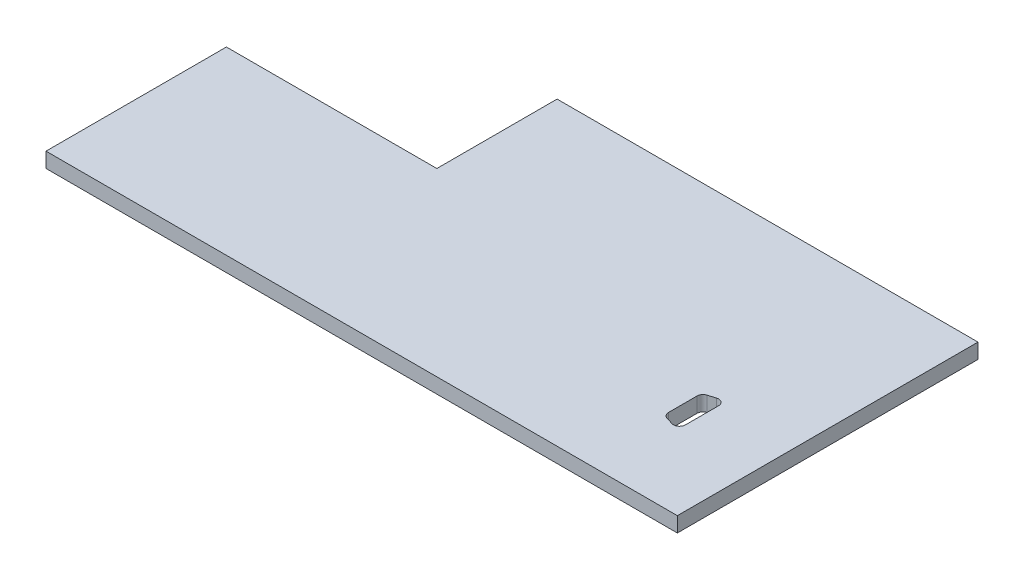
ISO-10303-21;
HEADER;
FILE_DESCRIPTION(('STEP AP214'),'2;1');
FILE_NAME('part.step','',(''),(''),'','','');
FILE_SCHEMA(('AUTOMOTIVE_DESIGN { 1 0 10303 214 1 1 1 1 }'));
ENDSEC;
DATA;
#1=APPLICATION_CONTEXT('core data for automotive mechanical design processes');
#2=APPLICATION_PROTOCOL_DEFINITION('international standard','automotive_design',2000,#1);
#3=PRODUCT_CONTEXT('',#1,'mechanical');
#4=PRODUCT('Part','Part','',(#3));
#5=PRODUCT_RELATED_PRODUCT_CATEGORY('part','',(#4));
#6=PRODUCT_DEFINITION_FORMATION('','',#4);
#7=PRODUCT_DEFINITION_CONTEXT('part definition',#1,'design');
#8=PRODUCT_DEFINITION('design','',#6,#7);
#9=PRODUCT_DEFINITION_SHAPE('','',#8);
#10=(LENGTH_UNIT() NAMED_UNIT(*) SI_UNIT(.MILLI.,.METRE.));
#11=(NAMED_UNIT(*) PLANE_ANGLE_UNIT() SI_UNIT($,.RADIAN.));
#12=(NAMED_UNIT(*) SI_UNIT($,.STERADIAN.) SOLID_ANGLE_UNIT());
#13=UNCERTAINTY_MEASURE_WITH_UNIT(LENGTH_MEASURE(1.E-05),#10,'distance_accuracy_value','');
#14=(GEOMETRIC_REPRESENTATION_CONTEXT(3) GLOBAL_UNCERTAINTY_ASSIGNED_CONTEXT((#13)) GLOBAL_UNIT_ASSIGNED_CONTEXT((#10,
#11,#12)) REPRESENTATION_CONTEXT('',''));
#15=CARTESIAN_POINT('',(0.,0.,0.));
#16=DIRECTION('',(0.,0.,1.));
#17=DIRECTION('',(1.,0.,0.));
#18=AXIS2_PLACEMENT_3D('',#15,#16,#17);
#19=CARTESIAN_POINT('',(266.7,6.35,0.));
#20=DIRECTION('',(0.,0.,-1.));
#21=DIRECTION('',(-1.,0.,0.));
#22=AXIS2_PLACEMENT_3D('',#19,#20,#21);
#23=PLANE('',#22);
#24=DIRECTION('',(1.,0.,0.));
#25=VECTOR('',#24,1.);
#26=CARTESIAN_POINT('',(266.7,0.,0.));
#27=LINE('',#26,#25);
#28=CARTESIAN_POINT('',(0.,0.,0.));
#29=VERTEX_POINT('',#28);
#30=CARTESIAN_POINT('',(266.7,0.,0.));
#31=VERTEX_POINT('',#30);
#32=EDGE_CURVE('E207',#29,#31,#27,.T.);
#33=ORIENTED_EDGE('',*,*,#32,.T.);
#34=DIRECTION('',(0.,-1.,0.));
#35=VECTOR('',#34,1.);
#36=CARTESIAN_POINT('',(266.7,6.35,0.));
#37=LINE('',#36,#35);
#38=CARTESIAN_POINT('',(266.7,6.35,0.));
#39=VERTEX_POINT('',#38);
#40=EDGE_CURVE('E255',#39,#31,#37,.T.);
#41=ORIENTED_EDGE('',*,*,#40,.F.);
#42=DIRECTION('',(1.,0.,0.));
#43=VECTOR('',#42,1.);
#44=CARTESIAN_POINT('',(266.7,6.35,0.));
#45=LINE('',#44,#43);
#46=CARTESIAN_POINT('',(0.,6.35,0.));
#47=VERTEX_POINT('',#46);
#48=EDGE_CURVE('E215',#47,#39,#45,.T.);
#49=ORIENTED_EDGE('',*,*,#48,.F.);
#50=DIRECTION('',(0.,-1.,0.));
#51=VECTOR('',#50,1.);
#52=CARTESIAN_POINT('',(0.,6.35,0.));
#53=LINE('',#52,#51);
#54=EDGE_CURVE('E229',#47,#29,#53,.T.);
#55=ORIENTED_EDGE('',*,*,#54,.T.);
#56=EDGE_LOOP('',(#33,#41,#49,#55));
#57=FACE_BOUND('',#56,.T.);
#58=ADVANCED_FACE('F33',(#57),#23,.F.);
#59=CARTESIAN_POINT('',(266.7,6.35,-127.));
#60=DIRECTION('',(-1.,0.,0.));
#61=DIRECTION('',(0.,0.,1.));
#62=AXIS2_PLACEMENT_3D('',#59,#60,#61);
#63=PLANE('',#62);
#64=DIRECTION('',(0.,0.,-1.));
#65=VECTOR('',#64,1.);
#66=CARTESIAN_POINT('',(266.7,0.,-127.));
#67=LINE('',#66,#65);
#68=CARTESIAN_POINT('',(266.7,0.,-127.));
#69=VERTEX_POINT('',#68);
#70=EDGE_CURVE('E232',#31,#69,#67,.T.);
#71=ORIENTED_EDGE('',*,*,#70,.T.);
#72=DIRECTION('',(0.,-1.,0.));
#73=VECTOR('',#72,1.);
#74=CARTESIAN_POINT('',(266.7,6.35,-127.));
#75=LINE('',#74,#73);
#76=CARTESIAN_POINT('',(266.7,6.35,-127.));
#77=VERTEX_POINT('',#76);
#78=EDGE_CURVE('E252',#77,#69,#75,.T.);
#79=ORIENTED_EDGE('',*,*,#78,.F.);
#80=DIRECTION('',(0.,0.,-1.));
#81=VECTOR('',#80,1.);
#82=CARTESIAN_POINT('',(266.7,6.35,-127.));
#83=LINE('',#82,#81);
#84=EDGE_CURVE('E218',#39,#77,#83,.T.);
#85=ORIENTED_EDGE('',*,*,#84,.F.);
#86=ORIENTED_EDGE('',*,*,#40,.T.);
#87=EDGE_LOOP('',(#71,#79,#85,#86));
#88=FACE_BOUND('',#87,.T.);
#89=ADVANCED_FACE('F331',(#88),#63,.F.);
#90=CARTESIAN_POINT('',(88.9,6.35,-127.));
#91=DIRECTION('',(0.,0.,1.));
#92=DIRECTION('',(1.,0.,0.));
#93=AXIS2_PLACEMENT_3D('',#90,#91,#92);
#94=PLANE('',#93);
#95=DIRECTION('',(-1.,0.,0.));
#96=VECTOR('',#95,1.);
#97=CARTESIAN_POINT('',(88.9,0.,-127.));
#98=LINE('',#97,#96);
#99=CARTESIAN_POINT('',(88.9,0.,-127.));
#100=VERTEX_POINT('',#99);
#101=EDGE_CURVE('E234',#69,#100,#98,.T.);
#102=ORIENTED_EDGE('',*,*,#101,.T.);
#103=DIRECTION('',(0.,-1.,0.));
#104=VECTOR('',#103,1.);
#105=CARTESIAN_POINT('',(88.9,6.35,-127.));
#106=LINE('',#105,#104);
#107=CARTESIAN_POINT('',(88.9,6.35,-127.));
#108=VERTEX_POINT('',#107);
#109=EDGE_CURVE('E249',#108,#100,#106,.T.);
#110=ORIENTED_EDGE('',*,*,#109,.F.);
#111=DIRECTION('',(-1.,0.,0.));
#112=VECTOR('',#111,1.);
#113=CARTESIAN_POINT('',(88.9,6.35,-127.));
#114=LINE('',#113,#112);
#115=EDGE_CURVE('E221',#77,#108,#114,.T.);
#116=ORIENTED_EDGE('',*,*,#115,.F.);
#117=ORIENTED_EDGE('',*,*,#78,.T.);
#118=EDGE_LOOP('',(#102,#110,#116,#117));
#119=FACE_BOUND('',#118,.T.);
#120=ADVANCED_FACE('F337',(#119),#94,.F.);
#121=CARTESIAN_POINT('',(88.9,6.35,-76.2));
#122=DIRECTION('',(1.,0.,0.));
#123=DIRECTION('',(0.,0.,-1.));
#124=AXIS2_PLACEMENT_3D('',#121,#122,#123);
#125=PLANE('',#124);
#126=DIRECTION('',(0.,0.,1.));
#127=VECTOR('',#126,1.);
#128=CARTESIAN_POINT('',(88.9,0.,-76.2));
#129=LINE('',#128,#127);
#130=CARTESIAN_POINT('',(88.9,0.,-107.95));
#131=VERTEX_POINT('',#130);
#132=EDGE_CURVE('E236',#100,#131,#129,.T.);
#133=ORIENTED_EDGE('',*,*,#132,.T.);
#134=DIRECTION('',(0.,1.,0.));
#135=VECTOR('',#134,1.);
#136=CARTESIAN_POINT('',(88.9,-5.08,-107.95));
#137=LINE('',#136,#135);
#138=CARTESIAN_POINT('',(88.9,-5.08,-107.95));
#139=VERTEX_POINT('',#138);
#140=EDGE_CURVE('E208',#139,#131,#137,.T.);
#141=ORIENTED_EDGE('',*,*,#140,.F.);
#142=DIRECTION('',(0.,0.,1.));
#143=VECTOR('',#142,1.);
#144=CARTESIAN_POINT('',(88.9,-5.08,-76.2));
#145=LINE('',#144,#143);
#146=CARTESIAN_POINT('',(88.9,-5.08,-76.2));
#147=VERTEX_POINT('',#146);
#148=EDGE_CURVE('E202',#139,#147,#145,.T.);
#149=ORIENTED_EDGE('',*,*,#148,.T.);
#150=DIRECTION('',(0.,-1.,0.));
#151=VECTOR('',#150,1.);
#152=CARTESIAN_POINT('',(88.9,6.35,-76.2));
#153=LINE('',#152,#151);
#154=CARTESIAN_POINT('',(88.9,6.35,-76.2));
#155=VERTEX_POINT('',#154);
#156=EDGE_CURVE('E247',#155,#147,#153,.T.);
#157=ORIENTED_EDGE('',*,*,#156,.F.);
#158=DIRECTION('',(0.,0.,1.));
#159=VECTOR('',#158,1.);
#160=CARTESIAN_POINT('',(88.9,6.35,-76.2));
#161=LINE('',#160,#159);
#162=EDGE_CURVE('E223',#108,#155,#161,.T.);
#163=ORIENTED_EDGE('',*,*,#162,.F.);
#164=ORIENTED_EDGE('',*,*,#109,.T.);
#165=EDGE_LOOP('',(#133,#141,#149,#157,#163,#164));
#166=FACE_BOUND('',#165,.T.);
#167=ADVANCED_FACE('F407',(#166),#125,.F.);
#168=CARTESIAN_POINT('',(0.,6.35,-76.2));
#169=DIRECTION('',(0.,0.,1.));
#170=DIRECTION('',(1.,0.,0.));
#171=AXIS2_PLACEMENT_3D('',#168,#169,#170);
#172=PLANE('',#171);
#173=DIRECTION('',(0.,-1.,0.));
#174=VECTOR('',#173,1.);
#175=CARTESIAN_POINT('',(0.,6.35,-76.2));
#176=LINE('',#175,#174);
#177=CARTESIAN_POINT('',(0.,6.35,-76.2));
#178=VERTEX_POINT('',#177);
#179=CARTESIAN_POINT('',(0.,0.,-76.2));
#180=VERTEX_POINT('',#179);
#181=EDGE_CURVE('E244',#178,#180,#176,.T.);
#182=ORIENTED_EDGE('',*,*,#181,.F.);
#183=DIRECTION('',(-1.,0.,0.));
#184=VECTOR('',#183,1.);
#185=CARTESIAN_POINT('',(0.,6.35,-76.2));
#186=LINE('',#185,#184);
#187=EDGE_CURVE('E225',#155,#178,#186,.T.);
#188=ORIENTED_EDGE('',*,*,#187,.F.);
#189=ORIENTED_EDGE('',*,*,#156,.T.);
#190=DIRECTION('',(-1.,0.,0.));
#191=VECTOR('',#190,1.);
#192=CARTESIAN_POINT('',(19.05,-5.08,-76.2));
#193=LINE('',#192,#191);
#194=CARTESIAN_POINT('',(19.05,-5.08,-76.2));
#195=VERTEX_POINT('',#194);
#196=EDGE_CURVE('E175',#147,#195,#193,.T.);
#197=ORIENTED_EDGE('',*,*,#196,.T.);
#198=DIRECTION('',(0.,1.,0.));
#199=VECTOR('',#198,1.);
#200=CARTESIAN_POINT('',(19.05,-5.08,-76.2));
#201=LINE('',#200,#199);
#202=CARTESIAN_POINT('',(19.05,0.,-76.2));
#203=VERTEX_POINT('',#202);
#204=EDGE_CURVE('E190',#195,#203,#201,.T.);
#205=ORIENTED_EDGE('',*,*,#204,.T.);
#206=DIRECTION('',(-1.,0.,0.));
#207=VECTOR('',#206,1.);
#208=CARTESIAN_POINT('',(0.,0.,-76.2));
#209=LINE('',#208,#207);
#210=EDGE_CURVE('E239',#203,#180,#209,.T.);
#211=ORIENTED_EDGE('',*,*,#210,.T.);
#212=EDGE_LOOP('',(#182,#188,#189,#197,#205,#211));
#213=FACE_BOUND('',#212,.T.);
#214=ADVANCED_FACE('F403',(#213),#172,.F.);
#215=CARTESIAN_POINT('',(0.,6.35,0.));
#216=DIRECTION('',(1.,0.,0.));
#217=DIRECTION('',(0.,0.,-1.));
#218=AXIS2_PLACEMENT_3D('',#215,#216,#217);
#219=PLANE('',#218);
#220=DIRECTION('',(0.,0.,1.));
#221=VECTOR('',#220,1.);
#222=CARTESIAN_POINT('',(0.,0.,0.));
#223=LINE('',#222,#221);
#224=EDGE_CURVE('E219',#180,#29,#223,.T.);
#225=ORIENTED_EDGE('',*,*,#224,.T.);
#226=ORIENTED_EDGE('',*,*,#54,.F.);
#227=DIRECTION('',(0.,0.,1.));
#228=VECTOR('',#227,1.);
#229=CARTESIAN_POINT('',(0.,6.35,0.));
#230=LINE('',#229,#228);
#231=EDGE_CURVE('E227',#178,#47,#230,.T.);
#232=ORIENTED_EDGE('',*,*,#231,.F.);
#233=ORIENTED_EDGE('',*,*,#181,.T.);
#234=EDGE_LOOP('',(#225,#226,#232,#233));
#235=FACE_BOUND('',#234,.T.);
#236=ADVANCED_FACE('F398',(#235),#219,.F.);
#237=CARTESIAN_POINT('',(0.,6.35,0.));
#238=DIRECTION('',(0.,-1.,0.));
#239=DIRECTION('',(0.,0.,-1.));
#240=AXIS2_PLACEMENT_3D('',#237,#238,#239);
#241=PLANE('',#240);
#242=DIRECTION('',(0.,0.,-1.));
#243=VECTOR('',#242,1.);
#244=CARTESIAN_POINT('',(235.204,6.35,-31.496));
#245=LINE('',#244,#243);
#246=CARTESIAN_POINT('',(235.204,6.35,-34.9508849200106));
#247=VERTEX_POINT('',#246);
#248=CARTESIAN_POINT('',(235.204,6.35,-48.8691150799894));
#249=VERTEX_POINT('',#248);
#250=EDGE_CURVE('E356',#247,#249,#245,.T.);
#251=ORIENTED_EDGE('',*,*,#250,.F.);
#252=CARTESIAN_POINT('',(232.664,6.35,-34.9508849200106));
#253=DIRECTION('',(0.,-1.,0.));
#254=DIRECTION('',(0.,0.,-1.));
#255=AXIS2_PLACEMENT_3D('',#252,#253,#254);
#256=CIRCLE('',#255,2.54);
#257=CARTESIAN_POINT('',(231.906381517435,6.35,-32.5265057758017));
#258=VERTEX_POINT('',#257);
#259=EDGE_CURVE('E298',#247,#258,#256,.T.);
#260=ORIENTED_EDGE('',*,*,#259,.T.);
#261=DIRECTION('',(0.95447997803503,0.,0.298274993135947));
#262=VECTOR('',#261,1.);
#263=CARTESIAN_POINT('',(227.076,6.35,-34.036));
#264=LINE('',#263,#262);
#265=CARTESIAN_POINT('',(228.858381517435,6.35,-33.4790057758017));
#266=VERTEX_POINT('',#265);
#267=EDGE_CURVE('E357',#266,#258,#264,.T.);
#268=ORIENTED_EDGE('',*,*,#267,.F.);
#269=CARTESIAN_POINT('',(229.616,6.35,-35.9033849200106));
#270=DIRECTION('',(0.,-1.,0.));
#271=DIRECTION('',(0.,0.,-1.));
#272=AXIS2_PLACEMENT_3D('',#269,#270,#271);
#273=CIRCLE('',#272,2.54);
#274=CARTESIAN_POINT('',(227.076,6.35,-35.9033849200106));
#275=VERTEX_POINT('',#274);
#276=EDGE_CURVE('E302',#266,#275,#273,.T.);
#277=ORIENTED_EDGE('',*,*,#276,.T.);
#278=DIRECTION('',(0.,0.,1.));
#279=VECTOR('',#278,1.);
#280=CARTESIAN_POINT('',(227.076,6.35,-49.784));
#281=LINE('',#280,#279);
#282=CARTESIAN_POINT('',(227.076,6.35,-47.9166150799894));
#283=VERTEX_POINT('',#282);
#284=EDGE_CURVE('E191',#283,#275,#281,.T.);
#285=ORIENTED_EDGE('',*,*,#284,.F.);
#286=CARTESIAN_POINT('',(229.616,6.35,-47.9166150799894));
#287=DIRECTION('',(0.,-1.,0.));
#288=DIRECTION('',(0.,0.,-1.));
#289=AXIS2_PLACEMENT_3D('',#286,#287,#288);
#290=CIRCLE('',#289,2.54);
#291=CARTESIAN_POINT('',(228.858381517435,6.35,-50.3409942241983));
#292=VERTEX_POINT('',#291);
#293=EDGE_CURVE('E41',#283,#292,#290,.T.);
#294=ORIENTED_EDGE('',*,*,#293,.T.);
#295=DIRECTION('',(-0.95447997803503,0.,0.298274993135947));
#296=VECTOR('',#295,1.);
#297=CARTESIAN_POINT('',(235.204,6.35,-52.324));
#298=LINE('',#297,#296);
#299=CARTESIAN_POINT('',(231.906381517435,6.35,-51.2934942241983));
#300=VERTEX_POINT('',#299);
#301=EDGE_CURVE('E194',#300,#292,#298,.T.);
#302=ORIENTED_EDGE('',*,*,#301,.F.);
#303=CARTESIAN_POINT('',(232.664,6.35,-48.8691150799894));
#304=DIRECTION('',(0.,-1.,0.));
#305=DIRECTION('',(0.,0.,-1.));
#306=AXIS2_PLACEMENT_3D('',#303,#304,#305);
#307=CIRCLE('',#306,2.54);
#308=EDGE_CURVE('E55',#300,#249,#307,.T.);
#309=ORIENTED_EDGE('',*,*,#308,.T.);
#310=EDGE_LOOP('',(#251,#260,#268,#277,#285,#294,#302,#309));
#311=FACE_BOUND('',#310,.T.);
#312=ORIENTED_EDGE('',*,*,#187,.T.);
#313=ORIENTED_EDGE('',*,*,#231,.T.);
#314=ORIENTED_EDGE('',*,*,#48,.T.);
#315=ORIENTED_EDGE('',*,*,#84,.T.);
#316=ORIENTED_EDGE('',*,*,#115,.T.);
#317=ORIENTED_EDGE('',*,*,#162,.T.);
#318=EDGE_LOOP('',(#312,#313,#314,#315,#316,#317));
#319=FACE_BOUND('',#318,.T.);
#320=ADVANCED_FACE('F365',(#311,#319),#241,.F.);
#321=CARTESIAN_POINT('',(0.,0.,0.));
#322=DIRECTION('',(0.,-1.,0.));
#323=DIRECTION('',(0.,0.,-1.));
#324=AXIS2_PLACEMENT_3D('',#321,#322,#323);
#325=PLANE('',#324);
#326=DIRECTION('',(-0.95447997803503,0.,-0.298274993135947));
#327=VECTOR('',#326,1.);
#328=CARTESIAN_POINT('',(29.8924555160143,0.,-95.6558576512456));
#329=LINE('',#328,#327);
#330=CARTESIAN_POINT('',(231.906381517435,0.,-32.5265057758017));
#331=VERTEX_POINT('',#330);
#332=CARTESIAN_POINT('',(228.858381517435,0.,-33.4790057758017));
#333=VERTEX_POINT('',#332);
#334=EDGE_CURVE('E276',#331,#333,#329,.T.);
#335=ORIENTED_EDGE('',*,*,#334,.F.);
#336=CARTESIAN_POINT('',(232.664,0.,-34.9508849200106));
#337=DIRECTION('',(0.,-1.,0.));
#338=DIRECTION('',(0.,0.,-1.));
#339=AXIS2_PLACEMENT_3D('',#336,#337,#338);
#340=CIRCLE('',#339,2.54);
#341=CARTESIAN_POINT('',(235.204,0.,-34.9508849200106));
#342=VERTEX_POINT('',#341);
#343=EDGE_CURVE('E300',#331,#342,#340,.F.);
#344=ORIENTED_EDGE('',*,*,#343,.T.);
#345=DIRECTION('',(0.,0.,1.));
#346=VECTOR('',#345,1.);
#347=CARTESIAN_POINT('',(235.204,0.,0.));
#348=LINE('',#347,#346);
#349=CARTESIAN_POINT('',(235.204,0.,-48.8691150799894));
#350=VERTEX_POINT('',#349);
#351=EDGE_CURVE('E267',#350,#342,#348,.T.);
#352=ORIENTED_EDGE('',*,*,#351,.F.);
#353=CARTESIAN_POINT('',(232.664,0.,-48.8691150799894));
#354=DIRECTION('',(0.,-1.,0.));
#355=DIRECTION('',(0.,0.,-1.));
#356=AXIS2_PLACEMENT_3D('',#353,#354,#355);
#357=CIRCLE('',#356,2.54);
#358=CARTESIAN_POINT('',(231.906381517435,0.,-51.2934942241983));
#359=VERTEX_POINT('',#358);
#360=EDGE_CURVE('E307',#350,#359,#357,.F.);
#361=ORIENTED_EDGE('',*,*,#360,.T.);
#362=DIRECTION('',(0.95447997803503,0.,-0.298274993135947));
#363=VECTOR('',#362,1.);
#364=CARTESIAN_POINT('',(6.02911032028472,0.,19.2931530249111));
#365=LINE('',#364,#363);
#366=CARTESIAN_POINT('',(228.858381517435,0.,-50.3409942241983));
#367=VERTEX_POINT('',#366);
#368=EDGE_CURVE('E270',#367,#359,#365,.T.);
#369=ORIENTED_EDGE('',*,*,#368,.F.);
#370=CARTESIAN_POINT('',(229.616,0.,-47.9166150799894));
#371=DIRECTION('',(0.,-1.,0.));
#372=DIRECTION('',(0.,0.,-1.));
#373=AXIS2_PLACEMENT_3D('',#370,#371,#372);
#374=CIRCLE('',#373,2.54);
#375=CARTESIAN_POINT('',(227.076,0.,-47.9166150799894));
#376=VERTEX_POINT('',#375);
#377=EDGE_CURVE('E11',#367,#376,#374,.F.);
#378=ORIENTED_EDGE('',*,*,#377,.T.);
#379=DIRECTION('',(0.,0.,-1.));
#380=VECTOR('',#379,1.);
#381=CARTESIAN_POINT('',(227.076,0.,0.));
#382=LINE('',#381,#380);
#383=CARTESIAN_POINT('',(227.076,0.,-35.9033849200106));
#384=VERTEX_POINT('',#383);
#385=EDGE_CURVE('E273',#384,#376,#382,.T.);
#386=ORIENTED_EDGE('',*,*,#385,.F.);
#387=CARTESIAN_POINT('',(229.616,0.,-35.9033849200106));
#388=DIRECTION('',(0.,-1.,0.));
#389=DIRECTION('',(0.,0.,-1.));
#390=AXIS2_PLACEMENT_3D('',#387,#388,#389);
#391=CIRCLE('',#390,2.54);
#392=EDGE_CURVE('E304',#384,#333,#391,.F.);
#393=ORIENTED_EDGE('',*,*,#392,.T.);
#394=EDGE_LOOP('',(#335,#344,#352,#361,#369,#378,#386,#393));
#395=FACE_BOUND('',#394,.T.);
#396=DIRECTION('',(0.,0.,-1.));
#397=VECTOR('',#396,1.);
#398=CARTESIAN_POINT('',(19.05,0.,0.));
#399=LINE('',#398,#397);
#400=CARTESIAN_POINT('',(19.05,0.,-63.5));
#401=VERTEX_POINT('',#400);
#402=EDGE_CURVE('E265',#401,#203,#399,.T.);
#403=ORIENTED_EDGE('',*,*,#402,.F.);
#404=DIRECTION('',(-1.,0.,0.));
#405=VECTOR('',#404,1.);
#406=CARTESIAN_POINT('',(0.,0.,-63.5));
#407=LINE('',#406,#405);
#408=CARTESIAN_POINT('',(101.6,0.,-63.5));
#409=VERTEX_POINT('',#408);
#410=EDGE_CURVE('E170',#409,#401,#407,.T.);
#411=ORIENTED_EDGE('',*,*,#410,.F.);
#412=DIRECTION('',(0.,0.,1.));
#413=VECTOR('',#412,1.);
#414=CARTESIAN_POINT('',(101.6,0.,0.));
#415=LINE('',#414,#413);
#416=CARTESIAN_POINT('',(101.6,0.,-107.95));
#417=VERTEX_POINT('',#416);
#418=EDGE_CURVE('E259',#417,#409,#415,.T.);
#419=ORIENTED_EDGE('',*,*,#418,.F.);
#420=DIRECTION('',(1.,0.,0.));
#421=VECTOR('',#420,1.);
#422=CARTESIAN_POINT('',(0.,0.,-107.95));
#423=LINE('',#422,#421);
#424=EDGE_CURVE('E262',#131,#417,#423,.T.);
#425=ORIENTED_EDGE('',*,*,#424,.F.);
#426=ORIENTED_EDGE('',*,*,#132,.F.);
#427=ORIENTED_EDGE('',*,*,#101,.F.);
#428=ORIENTED_EDGE('',*,*,#70,.F.);
#429=ORIENTED_EDGE('',*,*,#32,.F.);
#430=ORIENTED_EDGE('',*,*,#224,.F.);
#431=ORIENTED_EDGE('',*,*,#210,.F.);
#432=EDGE_LOOP('',(#403,#411,#419,#425,#426,#427,#428,#429,#430,#431));
#433=FACE_BOUND('',#432,.T.);
#434=ADVANCED_FACE('F313',(#395,#433),#325,.T.);
#435=CARTESIAN_POINT('',(19.05,-5.08,-63.5));
#436=DIRECTION('',(-1.,0.,0.));
#437=DIRECTION('',(0.,0.,1.));
#438=AXIS2_PLACEMENT_3D('',#435,#436,#437);
#439=PLANE('',#438);
#440=DIRECTION('',(0.,1.,0.));
#441=VECTOR('',#440,1.);
#442=CARTESIAN_POINT('',(19.05,-5.08,-63.5));
#443=LINE('',#442,#441);
#444=CARTESIAN_POINT('',(19.05,-5.08,-63.5));
#445=VERTEX_POINT('',#444);
#446=EDGE_CURVE('E165',#445,#401,#443,.T.);
#447=ORIENTED_EDGE('',*,*,#446,.T.);
#448=ORIENTED_EDGE('',*,*,#402,.T.);
#449=ORIENTED_EDGE('',*,*,#204,.F.);
#450=DIRECTION('',(0.,0.,1.));
#451=VECTOR('',#450,1.);
#452=CARTESIAN_POINT('',(19.05,-5.08,-63.5));
#453=LINE('',#452,#451);
#454=EDGE_CURVE('E182',#195,#445,#453,.T.);
#455=ORIENTED_EDGE('',*,*,#454,.T.);
#456=EDGE_LOOP('',(#447,#448,#449,#455));
#457=FACE_BOUND('',#456,.T.);
#458=ADVANCED_FACE('F188',(#457),#439,.T.);
#459=CARTESIAN_POINT('',(88.9,-5.08,-107.95));
#460=DIRECTION('',(0.,0.,-1.));
#461=DIRECTION('',(-1.,0.,0.));
#462=AXIS2_PLACEMENT_3D('',#459,#460,#461);
#463=PLANE('',#462);
#464=ORIENTED_EDGE('',*,*,#140,.T.);
#465=ORIENTED_EDGE('',*,*,#424,.T.);
#466=DIRECTION('',(0.,1.,0.));
#467=VECTOR('',#466,1.);
#468=CARTESIAN_POINT('',(101.6,-5.08,-107.95));
#469=LINE('',#468,#467);
#470=CARTESIAN_POINT('',(101.6,-5.08,-107.95));
#471=VERTEX_POINT('',#470);
#472=EDGE_CURVE('E211',#471,#417,#469,.T.);
#473=ORIENTED_EDGE('',*,*,#472,.F.);
#474=DIRECTION('',(-1.,0.,0.));
#475=VECTOR('',#474,1.);
#476=CARTESIAN_POINT('',(88.9,-5.08,-107.95));
#477=LINE('',#476,#475);
#478=EDGE_CURVE('E199',#471,#139,#477,.T.);
#479=ORIENTED_EDGE('',*,*,#478,.T.);
#480=EDGE_LOOP('',(#464,#465,#473,#479));
#481=FACE_BOUND('',#480,.T.);
#482=ADVANCED_FACE('F384',(#481),#463,.T.);
#483=CARTESIAN_POINT('',(101.6,-5.08,-63.5));
#484=DIRECTION('',(1.,0.,0.));
#485=DIRECTION('',(0.,0.,-1.));
#486=AXIS2_PLACEMENT_3D('',#483,#484,#485);
#487=PLANE('',#486);
#488=ORIENTED_EDGE('',*,*,#472,.T.);
#489=ORIENTED_EDGE('',*,*,#418,.T.);
#490=DIRECTION('',(0.,1.,0.));
#491=VECTOR('',#490,1.);
#492=CARTESIAN_POINT('',(101.6,-5.08,-63.5));
#493=LINE('',#492,#491);
#494=CARTESIAN_POINT('',(101.6,-5.08,-63.5));
#495=VERTEX_POINT('',#494);
#496=EDGE_CURVE('E174',#495,#409,#493,.T.);
#497=ORIENTED_EDGE('',*,*,#496,.F.);
#498=DIRECTION('',(0.,0.,-1.));
#499=VECTOR('',#498,1.);
#500=CARTESIAN_POINT('',(101.6,-5.08,-63.5));
#501=LINE('',#500,#499);
#502=EDGE_CURVE('E186',#495,#471,#501,.T.);
#503=ORIENTED_EDGE('',*,*,#502,.T.);
#504=EDGE_LOOP('',(#488,#489,#497,#503));
#505=FACE_BOUND('',#504,.T.);
#506=ADVANCED_FACE('F387',(#505),#487,.T.);
#507=CARTESIAN_POINT('',(19.05,-5.08,-63.5));
#508=DIRECTION('',(0.,0.,1.));
#509=DIRECTION('',(1.,0.,0.));
#510=AXIS2_PLACEMENT_3D('',#507,#508,#509);
#511=PLANE('',#510);
#512=ORIENTED_EDGE('',*,*,#496,.T.);
#513=ORIENTED_EDGE('',*,*,#410,.T.);
#514=ORIENTED_EDGE('',*,*,#446,.F.);
#515=DIRECTION('',(1.,0.,0.));
#516=VECTOR('',#515,1.);
#517=CARTESIAN_POINT('',(19.05,-5.08,-63.5));
#518=LINE('',#517,#516);
#519=EDGE_CURVE('E169',#445,#495,#518,.T.);
#520=ORIENTED_EDGE('',*,*,#519,.T.);
#521=EDGE_LOOP('',(#512,#513,#514,#520));
#522=FACE_BOUND('',#521,.T.);
#523=ADVANCED_FACE('F168',(#522),#511,.T.);
#524=CARTESIAN_POINT('',(0.,-5.08,0.));
#525=DIRECTION('',(0.,-1.,0.));
#526=DIRECTION('',(0.,0.,-1.));
#527=AXIS2_PLACEMENT_3D('',#524,#525,#526);
#528=PLANE('',#527);
#529=ORIENTED_EDGE('',*,*,#454,.F.);
#530=ORIENTED_EDGE('',*,*,#196,.F.);
#531=ORIENTED_EDGE('',*,*,#148,.F.);
#532=ORIENTED_EDGE('',*,*,#478,.F.);
#533=ORIENTED_EDGE('',*,*,#502,.F.);
#534=ORIENTED_EDGE('',*,*,#519,.F.);
#535=EDGE_LOOP('',(#529,#530,#531,#532,#533,#534));
#536=FACE_BOUND('',#535,.T.);
#537=ADVANCED_FACE('F180',(#536),#528,.T.);
#538=CARTESIAN_POINT('',(227.076,-6.35,-34.036));
#539=DIRECTION('',(-0.298274993135947,0.,0.95447997803503));
#540=DIRECTION('',(0.95447997803503,0.,0.298274993135947));
#541=AXIS2_PLACEMENT_3D('',#538,#539,#540);
#542=PLANE('',#541);
#543=ORIENTED_EDGE('',*,*,#267,.T.);
#544=DIRECTION('',(0.,1.,0.));
#545=VECTOR('',#544,1.);
#546=CARTESIAN_POINT('',(231.906381517435,0.,-32.5265057758017));
#547=LINE('',#546,#545);
#548=EDGE_CURVE('E287',#258,#331,#547,.F.);
#549=ORIENTED_EDGE('',*,*,#548,.T.);
#550=ORIENTED_EDGE('',*,*,#334,.T.);
#551=DIRECTION('',(0.,1.,0.));
#552=VECTOR('',#551,1.);
#553=CARTESIAN_POINT('',(228.858381517435,6.35,-33.4790057758017));
#554=LINE('',#553,#552);
#555=EDGE_CURVE('E284',#333,#266,#554,.T.);
#556=ORIENTED_EDGE('',*,*,#555,.T.);
#557=EDGE_LOOP('',(#543,#549,#550,#556));
#558=FACE_BOUND('',#557,.T.);
#559=ADVANCED_FACE('F363',(#558),#542,.F.);
#560=CARTESIAN_POINT('',(227.076,-6.35,-49.784));
#561=DIRECTION('',(-1.,0.,0.));
#562=DIRECTION('',(0.,0.,1.));
#563=AXIS2_PLACEMENT_3D('',#560,#561,#562);
#564=PLANE('',#563);
#565=ORIENTED_EDGE('',*,*,#284,.T.);
#566=DIRECTION('',(0.,1.,0.));
#567=VECTOR('',#566,1.);
#568=CARTESIAN_POINT('',(227.076,0.,-35.9033849200106));
#569=LINE('',#568,#567);
#570=EDGE_CURVE('E292',#275,#384,#569,.F.);
#571=ORIENTED_EDGE('',*,*,#570,.T.);
#572=ORIENTED_EDGE('',*,*,#385,.T.);
#573=DIRECTION('',(0.,1.,0.));
#574=VECTOR('',#573,1.);
#575=CARTESIAN_POINT('',(227.076,6.35,-47.9166150799894));
#576=LINE('',#575,#574);
#577=EDGE_CURVE('E289',#376,#283,#576,.T.);
#578=ORIENTED_EDGE('',*,*,#577,.T.);
#579=EDGE_LOOP('',(#565,#571,#572,#578));
#580=FACE_BOUND('',#579,.T.);
#581=ADVANCED_FACE('F369',(#580),#564,.F.);
#582=CARTESIAN_POINT('',(235.204,-6.35,-52.324));
#583=DIRECTION('',(-0.298274993135947,0.,-0.95447997803503));
#584=DIRECTION('',(-0.95447997803503,0.,0.298274993135947));
#585=AXIS2_PLACEMENT_3D('',#582,#583,#584);
#586=PLANE('',#585);
#587=ORIENTED_EDGE('',*,*,#368,.T.);
#588=DIRECTION('',(0.,1.,0.));
#589=VECTOR('',#588,1.);
#590=CARTESIAN_POINT('',(231.906381517435,6.35,-51.2934942241983));
#591=LINE('',#590,#589);
#592=EDGE_CURVE('E296',#359,#300,#591,.T.);
#593=ORIENTED_EDGE('',*,*,#592,.T.);
#594=ORIENTED_EDGE('',*,*,#301,.T.);
#595=DIRECTION('',(0.,1.,0.));
#596=VECTOR('',#595,1.);
#597=CARTESIAN_POINT('',(228.858381517435,0.,-50.3409942241983));
#598=LINE('',#597,#596);
#599=EDGE_CURVE('E294',#292,#367,#598,.F.);
#600=ORIENTED_EDGE('',*,*,#599,.T.);
#601=EDGE_LOOP('',(#587,#593,#594,#600));
#602=FACE_BOUND('',#601,.T.);
#603=ADVANCED_FACE('F317',(#602),#586,.F.);
#604=CARTESIAN_POINT('',(235.204,-6.35,-31.496));
#605=DIRECTION('',(1.,0.,0.));
#606=DIRECTION('',(0.,0.,-1.));
#607=AXIS2_PLACEMENT_3D('',#604,#605,#606);
#608=PLANE('',#607);
#609=ORIENTED_EDGE('',*,*,#351,.T.);
#610=DIRECTION('',(0.,1.,0.));
#611=VECTOR('',#610,1.);
#612=CARTESIAN_POINT('',(235.204,6.35,-34.9508849200106));
#613=LINE('',#612,#611);
#614=EDGE_CURVE('E281',#342,#247,#613,.T.);
#615=ORIENTED_EDGE('',*,*,#614,.T.);
#616=ORIENTED_EDGE('',*,*,#250,.T.);
#617=DIRECTION('',(0.,1.,0.));
#618=VECTOR('',#617,1.);
#619=CARTESIAN_POINT('',(235.204,0.,-48.8691150799894));
#620=LINE('',#619,#618);
#621=EDGE_CURVE('E279',#249,#350,#620,.F.);
#622=ORIENTED_EDGE('',*,*,#621,.T.);
#623=EDGE_LOOP('',(#609,#615,#616,#622));
#624=FACE_BOUND('',#623,.T.);
#625=ADVANCED_FACE('F343',(#624),#608,.F.);
#626=CARTESIAN_POINT('',(232.664,-6.35,-34.9508849200106));
#627=DIRECTION('',(0.,-1.,0.));
#628=DIRECTION('',(0.,0.,-1.));
#629=AXIS2_PLACEMENT_3D('',#626,#627,#628);
#630=CYLINDRICAL_SURFACE('',#629,2.54);
#631=ORIENTED_EDGE('',*,*,#343,.F.);
#632=ORIENTED_EDGE('',*,*,#548,.F.);
#633=ORIENTED_EDGE('',*,*,#259,.F.);
#634=ORIENTED_EDGE('',*,*,#614,.F.);
#635=EDGE_LOOP('',(#631,#632,#633,#634));
#636=FACE_BOUND('',#635,.T.);
#637=ADVANCED_FACE('F327',(#636),#630,.F.);
#638=CARTESIAN_POINT('',(229.616,-6.35,-35.9033849200106));
#639=DIRECTION('',(0.,-1.,0.));
#640=DIRECTION('',(0.,0.,-1.));
#641=AXIS2_PLACEMENT_3D('',#638,#639,#640);
#642=CYLINDRICAL_SURFACE('',#641,2.54);
#643=ORIENTED_EDGE('',*,*,#392,.F.);
#644=ORIENTED_EDGE('',*,*,#570,.F.);
#645=ORIENTED_EDGE('',*,*,#276,.F.);
#646=ORIENTED_EDGE('',*,*,#555,.F.);
#647=EDGE_LOOP('',(#643,#644,#645,#646));
#648=FACE_BOUND('',#647,.T.);
#649=ADVANCED_FACE('F321',(#648),#642,.F.);
#650=CARTESIAN_POINT('',(232.664,-6.35,-48.8691150799894));
#651=DIRECTION('',(0.,-1.,0.));
#652=DIRECTION('',(0.,0.,-1.));
#653=AXIS2_PLACEMENT_3D('',#650,#651,#652);
#654=CYLINDRICAL_SURFACE('',#653,2.54);
#655=ORIENTED_EDGE('',*,*,#360,.F.);
#656=ORIENTED_EDGE('',*,*,#621,.F.);
#657=ORIENTED_EDGE('',*,*,#308,.F.);
#658=ORIENTED_EDGE('',*,*,#592,.F.);
#659=EDGE_LOOP('',(#655,#656,#657,#658));
#660=FACE_BOUND('',#659,.T.);
#661=ADVANCED_FACE('F319',(#660),#654,.F.);
#662=CARTESIAN_POINT('',(229.616,-6.35,-47.9166150799894));
#663=DIRECTION('',(0.,-1.,0.));
#664=DIRECTION('',(0.,0.,-1.));
#665=AXIS2_PLACEMENT_3D('',#662,#663,#664);
#666=CYLINDRICAL_SURFACE('',#665,2.54);
#667=ORIENTED_EDGE('',*,*,#377,.F.);
#668=ORIENTED_EDGE('',*,*,#599,.F.);
#669=ORIENTED_EDGE('',*,*,#293,.F.);
#670=ORIENTED_EDGE('',*,*,#577,.F.);
#671=EDGE_LOOP('',(#667,#668,#669,#670));
#672=FACE_BOUND('',#671,.T.);
#673=ADVANCED_FACE('F35',(#672),#666,.F.);
#674=CLOSED_SHELL('',(#58,#89,#120,#167,#214,#236,#320,#434,#458,#482,#506,#523,#537,#559,#581,
#603,#625,#637,#649,#661,#673));
#675=MANIFOLD_SOLID_BREP('B2',#674);
#676=ADVANCED_BREP_SHAPE_REPRESENTATION('',(#18,#675),#14);
#677=SHAPE_DEFINITION_REPRESENTATION(#9,#676);
ENDSEC;
END-ISO-10303-21;
